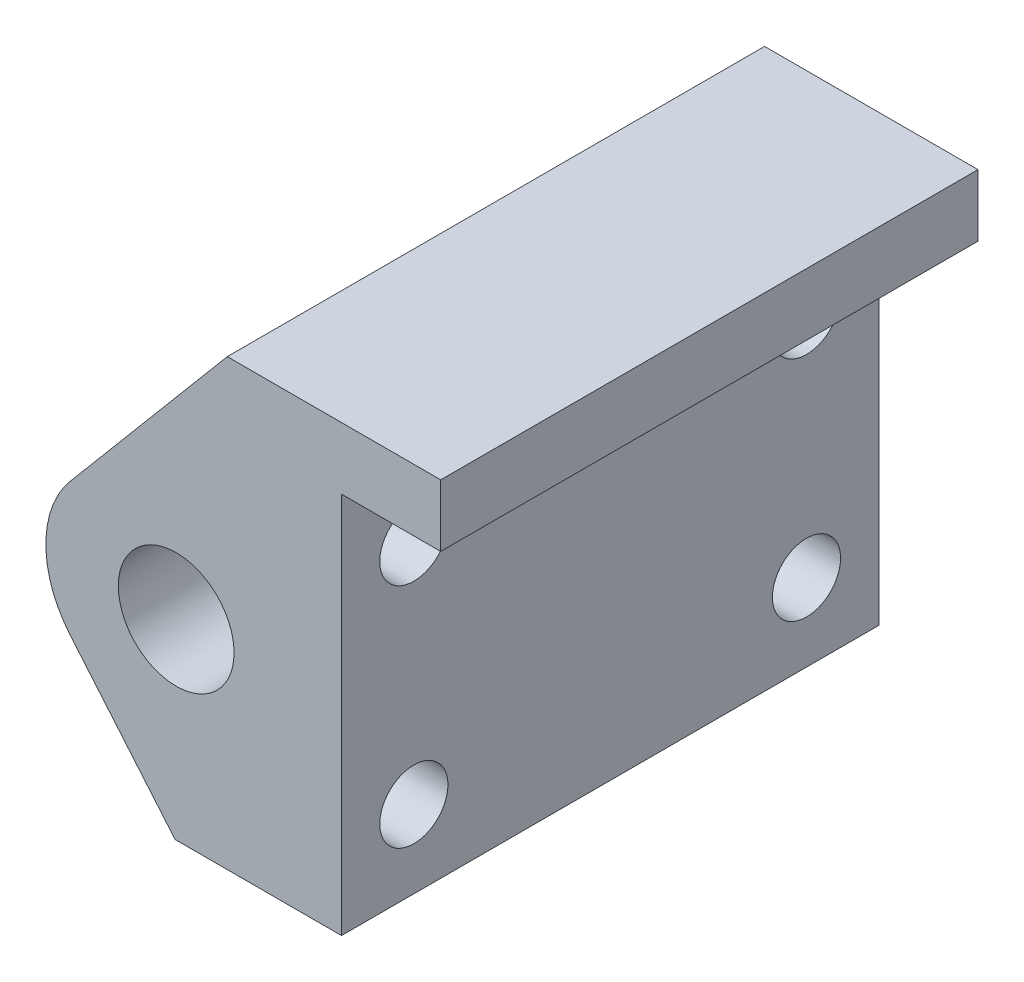
ISO-10303-21;
HEADER;
FILE_DESCRIPTION(('STEP AP214'),'2;1');
FILE_NAME('part.step','',(''),(''),'','','');
FILE_SCHEMA(('AUTOMOTIVE_DESIGN { 1 0 10303 214 1 1 1 1 }'));
ENDSEC;
DATA;
#1=APPLICATION_CONTEXT('core data for automotive mechanical design processes');
#2=APPLICATION_PROTOCOL_DEFINITION('international standard','automotive_design',2000,#1);
#3=PRODUCT_CONTEXT('',#1,'mechanical');
#4=PRODUCT('Part','Part','',(#3));
#5=PRODUCT_RELATED_PRODUCT_CATEGORY('part','',(#4));
#6=PRODUCT_DEFINITION_FORMATION('','',#4);
#7=PRODUCT_DEFINITION_CONTEXT('part definition',#1,'design');
#8=PRODUCT_DEFINITION('design','',#6,#7);
#9=PRODUCT_DEFINITION_SHAPE('','',#8);
#10=(LENGTH_UNIT() NAMED_UNIT(*) SI_UNIT(.MILLI.,.METRE.));
#11=(NAMED_UNIT(*) PLANE_ANGLE_UNIT() SI_UNIT($,.RADIAN.));
#12=(NAMED_UNIT(*) SI_UNIT($,.STERADIAN.) SOLID_ANGLE_UNIT());
#13=UNCERTAINTY_MEASURE_WITH_UNIT(LENGTH_MEASURE(1.E-05),#10,'distance_accuracy_value','');
#14=(GEOMETRIC_REPRESENTATION_CONTEXT(3) GLOBAL_UNCERTAINTY_ASSIGNED_CONTEXT((#13)) GLOBAL_UNIT_ASSIGNED_CONTEXT((#10,
#11,#12)) REPRESENTATION_CONTEXT('',''));
#15=CARTESIAN_POINT('',(0.,0.,0.));
#16=DIRECTION('',(0.,0.,1.));
#17=DIRECTION('',(1.,0.,0.));
#18=AXIS2_PLACEMENT_3D('',#15,#16,#17);
#19=CARTESIAN_POINT('',(-15.0280704909388,12.6577813905121,26.));
#20=DIRECTION('',(0.764846895843587,-0.644212096997898,0.));
#21=DIRECTION('',(0.644212096997898,0.764846895843587,0.));
#22=AXIS2_PLACEMENT_3D('',#19,#20,#21);
#23=PLANE('',#22);
#24=DIRECTION('',(-0.644212096997898,-0.764846895843587,0.));
#25=VECTOR('',#24,1.);
#26=CARTESIAN_POINT('',(-15.0280704909388,12.6577813905121,26.));
#27=LINE('',#26,#25);
#28=CARTESIAN_POINT('',(-2.52682765857616,27.5,26.));
#29=VERTEX_POINT('',#28);
#30=CARTESIAN_POINT('',(-10.1316856899561,18.4710604849895,26.));
#31=VERTEX_POINT('',#30);
#32=EDGE_CURVE('E128',#29,#31,#27,.T.);
#33=ORIENTED_EDGE('',*,*,#32,.F.);
#34=DIRECTION('',(0.,0.,1.));
#35=VECTOR('',#34,1.);
#36=CARTESIAN_POINT('',(-2.52682765857616,27.5,26.));
#37=LINE('',#36,#35);
#38=CARTESIAN_POINT('',(-2.52682765857616,27.5,0.));
#39=VERTEX_POINT('',#38);
#40=EDGE_CURVE('E175',#39,#29,#37,.T.);
#41=ORIENTED_EDGE('',*,*,#40,.F.);
#42=DIRECTION('',(-0.644212096997898,-0.764846895843587,0.));
#43=VECTOR('',#42,1.);
#44=CARTESIAN_POINT('',(-15.0280704909388,12.6577813905121,0.));
#45=LINE('',#44,#43);
#46=CARTESIAN_POINT('',(-10.1316856899561,18.4710604849895,0.));
#47=VERTEX_POINT('',#46);
#48=EDGE_CURVE('E140',#39,#47,#45,.T.);
#49=ORIENTED_EDGE('',*,*,#48,.T.);
#50=DIRECTION('',(0.,0.,-1.));
#51=VECTOR('',#50,1.);
#52=CARTESIAN_POINT('',(-10.1316856899561,18.4710604849895,26.));
#53=LINE('',#52,#51);
#54=EDGE_CURVE('E11',#31,#47,#53,.T.);
#55=ORIENTED_EDGE('',*,*,#54,.F.);
#56=EDGE_LOOP('',(#33,#41,#49,#55));
#57=FACE_BOUND('',#56,.T.);
#58=CARTESIAN_POINT('',(-8.21218989037251,20.75,3.5));
#59=DIRECTION('',(0.764846895843587,-0.644212096997898,0.));
#60=DIRECTION('',(0.644212096997898,0.764846895843587,0.));
#61=AXIS2_PLACEMENT_3D('',#58,#59,#60);
#62=ELLIPSE('',#61,2.15729449771791,1.65);
#63=CARTESIAN_POINT('',(-6.82243467815562,22.4,3.5));
#64=VERTEX_POINT('',#63);
#65=EDGE_CURVE('E190',#64,#64,#62,.F.);
#66=ORIENTED_EDGE('',*,*,#65,.F.);
#67=EDGE_LOOP('',(#66));
#68=FACE_BOUND('',#67,.T.);
#69=CARTESIAN_POINT('',(-8.21218989037251,20.75,22.5));
#70=DIRECTION('',(0.764846895843587,-0.644212096997898,0.));
#71=DIRECTION('',(0.644212096997898,0.764846895843587,0.));
#72=AXIS2_PLACEMENT_3D('',#69,#70,#71);
#73=ELLIPSE('',#72,2.15729449771792,1.65);
#74=CARTESIAN_POINT('',(-6.82243467815562,22.4,22.5));
#75=VERTEX_POINT('',#74);
#76=EDGE_CURVE('E196',#75,#75,#73,.T.);
#77=ORIENTED_EDGE('',*,*,#76,.T.);
#78=EDGE_LOOP('',(#77));
#79=FACE_BOUND('',#78,.T.);
#80=ADVANCED_FACE('F38',(#57,#68,#79),#23,.F.);
#81=CARTESIAN_POINT('',(0.,0.,26.));
#82=DIRECTION('',(0.764846895843587,0.644212096997898,0.));
#83=DIRECTION('',(-0.644212096997898,0.764846895843587,0.));
#84=AXIS2_PLACEMENT_3D('',#81,#82,#83);
#85=PLANE('',#84);
#86=DIRECTION('',(0.644212096997898,-0.764846895843587,0.));
#87=VECTOR('',#86,1.);
#88=CARTESIAN_POINT('',(0.,0.,0.));
#89=LINE('',#88,#87);
#90=CARTESIAN_POINT('',(-10.1316856899561,12.0289395150105,0.));
#91=VERTEX_POINT('',#90);
#92=CARTESIAN_POINT('',(-5.05365531715231,5.99999999999999,0.));
#93=VERTEX_POINT('',#92);
#94=EDGE_CURVE('E117',#91,#93,#89,.T.);
#95=ORIENTED_EDGE('',*,*,#94,.T.);
#96=DIRECTION('',(0.,0.,-1.));
#97=VECTOR('',#96,1.);
#98=CARTESIAN_POINT('',(-5.05365531715231,5.99999999999999,26.));
#99=LINE('',#98,#97);
#100=CARTESIAN_POINT('',(-5.05365531715231,5.99999999999999,26.));
#101=VERTEX_POINT('',#100);
#102=EDGE_CURVE('E52',#101,#93,#99,.T.);
#103=ORIENTED_EDGE('',*,*,#102,.F.);
#104=DIRECTION('',(0.644212096997898,-0.764846895843587,0.));
#105=VECTOR('',#104,1.);
#106=CARTESIAN_POINT('',(0.,0.,26.));
#107=LINE('',#106,#105);
#108=CARTESIAN_POINT('',(-10.1316856899561,12.0289395150105,26.));
#109=VERTEX_POINT('',#108);
#110=EDGE_CURVE('E115',#109,#101,#107,.T.);
#111=ORIENTED_EDGE('',*,*,#110,.F.);
#112=DIRECTION('',(0.,0.,-1.));
#113=VECTOR('',#112,1.);
#114=CARTESIAN_POINT('',(-10.1316856899561,12.0289395150105,26.));
#115=LINE('',#114,#113);
#116=EDGE_CURVE('E45',#109,#91,#115,.T.);
#117=ORIENTED_EDGE('',*,*,#116,.T.);
#118=EDGE_LOOP('',(#95,#103,#111,#117));
#119=FACE_BOUND('',#118,.T.);
#120=CARTESIAN_POINT('',(-8.21218989037251,9.75,22.5));
#121=DIRECTION('',(0.764846895843587,0.644212096997898,0.));
#122=DIRECTION('',(0.644212096997898,-0.764846895843587,0.));
#123=AXIS2_PLACEMENT_3D('',#120,#121,#122);
#124=ELLIPSE('',#123,2.15729449771792,1.65);
#125=CARTESIAN_POINT('',(-6.82243467815562,8.1,22.5));
#126=VERTEX_POINT('',#125);
#127=EDGE_CURVE('E193',#126,#126,#124,.F.);
#128=ORIENTED_EDGE('',*,*,#127,.F.);
#129=EDGE_LOOP('',(#128));
#130=FACE_BOUND('',#129,.T.);
#131=CARTESIAN_POINT('',(-8.21218989037251,9.75,3.5));
#132=DIRECTION('',(0.764846895843587,0.644212096997898,0.));
#133=DIRECTION('',(0.644212096997898,-0.764846895843587,0.));
#134=AXIS2_PLACEMENT_3D('',#131,#132,#133);
#135=ELLIPSE('',#134,2.15729449771792,1.65);
#136=CARTESIAN_POINT('',(-6.82243467815562,8.1,3.5));
#137=VERTEX_POINT('',#136);
#138=EDGE_CURVE('E143',#137,#137,#135,.T.);
#139=ORIENTED_EDGE('',*,*,#138,.T.);
#140=EDGE_LOOP('',(#139));
#141=FACE_BOUND('',#140,.T.);
#142=ADVANCED_FACE('F112',(#119,#130,#141),#85,.F.);
#143=CARTESIAN_POINT('',(3.,0.,26.));
#144=DIRECTION('',(-1.,0.,0.));
#145=DIRECTION('',(0.,-1.,0.));
#146=AXIS2_PLACEMENT_3D('',#143,#144,#145);
#147=PLANE('',#146);
#148=CARTESIAN_POINT('',(3.,20.75,22.5));
#149=DIRECTION('',(1.,0.,0.));
#150=DIRECTION('',(0.,0.,-1.));
#151=AXIS2_PLACEMENT_3D('',#148,#149,#150);
#152=CIRCLE('',#151,1.65);
#153=CARTESIAN_POINT('',(3.,20.75,20.85));
#154=VERTEX_POINT('',#153);
#155=EDGE_CURVE('E183',#154,#154,#152,.T.);
#156=ORIENTED_EDGE('',*,*,#155,.F.);
#157=EDGE_LOOP('',(#156));
#158=FACE_BOUND('',#157,.T.);
#159=CARTESIAN_POINT('',(3.,9.75,22.5));
#160=DIRECTION('',(1.,0.,0.));
#161=DIRECTION('',(0.,0.,-1.));
#162=AXIS2_PLACEMENT_3D('',#159,#160,#161);
#163=CIRCLE('',#162,1.65);
#164=CARTESIAN_POINT('',(3.,9.75,20.85));
#165=VERTEX_POINT('',#164);
#166=EDGE_CURVE('E179',#165,#165,#163,.F.);
#167=ORIENTED_EDGE('',*,*,#166,.T.);
#168=EDGE_LOOP('',(#167));
#169=FACE_BOUND('',#168,.T.);
#170=CARTESIAN_POINT('',(3.,20.75,3.5));
#171=DIRECTION('',(1.,0.,0.));
#172=DIRECTION('',(0.,0.,-1.));
#173=AXIS2_PLACEMENT_3D('',#170,#171,#172);
#174=CIRCLE('',#173,1.65);
#175=CARTESIAN_POINT('',(3.,20.75,1.85));
#176=VERTEX_POINT('',#175);
#177=EDGE_CURVE('E182',#176,#176,#174,.F.);
#178=ORIENTED_EDGE('',*,*,#177,.T.);
#179=EDGE_LOOP('',(#178));
#180=FACE_BOUND('',#179,.T.);
#181=DIRECTION('',(0.,1.,0.));
#182=VECTOR('',#181,1.);
#183=CARTESIAN_POINT('',(3.,0.,0.));
#184=LINE('',#183,#182);
#185=CARTESIAN_POINT('',(3.,5.99999999999999,0.));
#186=VERTEX_POINT('',#185);
#187=CARTESIAN_POINT('',(3.,24.5,0.));
#188=VERTEX_POINT('',#187);
#189=EDGE_CURVE('E146',#186,#188,#184,.T.);
#190=ORIENTED_EDGE('',*,*,#189,.T.);
#191=DIRECTION('',(0.,0.,-1.));
#192=VECTOR('',#191,1.);
#193=CARTESIAN_POINT('',(3.,24.5,26.));
#194=LINE('',#193,#192);
#195=CARTESIAN_POINT('',(3.,24.5,26.));
#196=VERTEX_POINT('',#195);
#197=EDGE_CURVE('E158',#196,#188,#194,.T.);
#198=ORIENTED_EDGE('',*,*,#197,.F.);
#199=DIRECTION('',(0.,1.,0.));
#200=VECTOR('',#199,1.);
#201=CARTESIAN_POINT('',(3.,0.,26.));
#202=LINE('',#201,#200);
#203=CARTESIAN_POINT('',(3.,5.99999999999999,26.));
#204=VERTEX_POINT('',#203);
#205=EDGE_CURVE('E124',#204,#196,#202,.T.);
#206=ORIENTED_EDGE('',*,*,#205,.F.);
#207=DIRECTION('',(0.,0.,-1.));
#208=VECTOR('',#207,1.);
#209=CARTESIAN_POINT('',(3.,6.,26.));
#210=LINE('',#209,#208);
#211=EDGE_CURVE('E103',#204,#186,#210,.T.);
#212=ORIENTED_EDGE('',*,*,#211,.T.);
#213=EDGE_LOOP('',(#190,#198,#206,#212));
#214=FACE_BOUND('',#213,.T.);
#215=CARTESIAN_POINT('',(3.,9.75,3.5));
#216=DIRECTION('',(1.,0.,0.));
#217=DIRECTION('',(0.,0.,-1.));
#218=AXIS2_PLACEMENT_3D('',#215,#216,#217);
#219=CIRCLE('',#218,1.65);
#220=CARTESIAN_POINT('',(3.,9.75,1.85));
#221=VERTEX_POINT('',#220);
#222=EDGE_CURVE('E178',#221,#221,#219,.T.);
#223=ORIENTED_EDGE('',*,*,#222,.F.);
#224=EDGE_LOOP('',(#223));
#225=FACE_BOUND('',#224,.T.);
#226=ADVANCED_FACE('F210',(#158,#169,#180,#214,#225),#147,.F.);
#227=CARTESIAN_POINT('',(-6.30745121073813,15.25,26.));
#228=DIRECTION('',(0.,0.,-1.));
#229=DIRECTION('',(-1.,0.,0.));
#230=AXIS2_PLACEMENT_3D('',#227,#228,#229);
#231=CYLINDRICAL_SURFACE('',#230,5.);
#232=CARTESIAN_POINT('',(-6.30745121073813,15.25,0.));
#233=DIRECTION('',(0.,0.,1.));
#234=DIRECTION('',(1.,0.,0.));
#235=AXIS2_PLACEMENT_3D('',#232,#233,#234);
#236=CIRCLE('',#235,5.);
#237=EDGE_CURVE('E142',#47,#91,#236,.T.);
#238=ORIENTED_EDGE('',*,*,#237,.T.);
#239=ORIENTED_EDGE('',*,*,#116,.F.);
#240=CARTESIAN_POINT('',(-6.30745121073813,15.25,26.));
#241=DIRECTION('',(0.,0.,1.));
#242=DIRECTION('',(1.,0.,0.));
#243=AXIS2_PLACEMENT_3D('',#240,#241,#242);
#244=CIRCLE('',#243,5.);
#245=EDGE_CURVE('E122',#31,#109,#244,.T.);
#246=ORIENTED_EDGE('',*,*,#245,.F.);
#247=ORIENTED_EDGE('',*,*,#54,.T.);
#248=EDGE_LOOP('',(#238,#239,#246,#247));
#249=FACE_BOUND('',#248,.T.);
#250=ADVANCED_FACE('F207',(#249),#231,.T.);
#251=CARTESIAN_POINT('',(0.,24.5,26.));
#252=DIRECTION('',(0.,1.,0.));
#253=DIRECTION('',(0.,0.,1.));
#254=AXIS2_PLACEMENT_3D('',#251,#252,#253);
#255=PLANE('',#254);
#256=DIRECTION('',(1.,0.,0.));
#257=VECTOR('',#256,1.);
#258=CARTESIAN_POINT('',(0.,24.5,0.));
#259=LINE('',#258,#257);
#260=CARTESIAN_POINT('',(7.8,24.5,0.));
#261=VERTEX_POINT('',#260);
#262=EDGE_CURVE('E148',#188,#261,#259,.T.);
#263=ORIENTED_EDGE('',*,*,#262,.T.);
#264=DIRECTION('',(0.,0.,-1.));
#265=VECTOR('',#264,1.);
#266=CARTESIAN_POINT('',(7.8,24.5,26.));
#267=LINE('',#266,#265);
#268=CARTESIAN_POINT('',(7.8,24.5,26.));
#269=VERTEX_POINT('',#268);
#270=EDGE_CURVE('E139',#269,#261,#267,.T.);
#271=ORIENTED_EDGE('',*,*,#270,.F.);
#272=DIRECTION('',(1.,0.,0.));
#273=VECTOR('',#272,1.);
#274=CARTESIAN_POINT('',(0.,24.5,26.));
#275=LINE('',#274,#273);
#276=EDGE_CURVE('E126',#196,#269,#275,.T.);
#277=ORIENTED_EDGE('',*,*,#276,.F.);
#278=ORIENTED_EDGE('',*,*,#197,.T.);
#279=EDGE_LOOP('',(#263,#271,#277,#278));
#280=FACE_BOUND('',#279,.T.);
#281=ADVANCED_FACE('F209',(#280),#255,.F.);
#282=CARTESIAN_POINT('',(7.8,0.,26.));
#283=DIRECTION('',(1.,0.,0.));
#284=DIRECTION('',(0.,0.,-1.));
#285=AXIS2_PLACEMENT_3D('',#282,#283,#284);
#286=PLANE('',#285);
#287=DIRECTION('',(0.,0.,-1.));
#288=VECTOR('',#287,1.);
#289=CARTESIAN_POINT('',(7.8,27.5,26.));
#290=LINE('',#289,#288);
#291=CARTESIAN_POINT('',(7.8,27.5,26.));
#292=VERTEX_POINT('',#291);
#293=CARTESIAN_POINT('',(7.8,27.5,0.));
#294=VERTEX_POINT('',#293);
#295=EDGE_CURVE('E60',#292,#294,#290,.T.);
#296=ORIENTED_EDGE('',*,*,#295,.F.);
#297=DIRECTION('',(0.,-1.,0.));
#298=VECTOR('',#297,1.);
#299=CARTESIAN_POINT('',(7.8,0.,26.));
#300=LINE('',#299,#298);
#301=EDGE_CURVE('E134',#292,#269,#300,.T.);
#302=ORIENTED_EDGE('',*,*,#301,.T.);
#303=ORIENTED_EDGE('',*,*,#270,.T.);
#304=DIRECTION('',(0.,-1.,0.));
#305=VECTOR('',#304,1.);
#306=CARTESIAN_POINT('',(7.8,0.,0.));
#307=LINE('',#306,#305);
#308=EDGE_CURVE('E151',#294,#261,#307,.T.);
#309=ORIENTED_EDGE('',*,*,#308,.F.);
#310=EDGE_LOOP('',(#296,#302,#303,#309));
#311=FACE_BOUND('',#310,.T.);
#312=ADVANCED_FACE('F215',(#311),#286,.T.);
#313=CARTESIAN_POINT('',(-5.,15.25,26.));
#314=DIRECTION('',(0.,0.,-1.));
#315=DIRECTION('',(-1.,0.,0.));
#316=AXIS2_PLACEMENT_3D('',#313,#314,#315);
#317=CYLINDRICAL_SURFACE('',#316,2.8);
#318=CARTESIAN_POINT('',(-5.,15.25,26.));
#319=DIRECTION('',(0.,0.,1.));
#320=DIRECTION('',(1.,0.,0.));
#321=AXIS2_PLACEMENT_3D('',#318,#319,#320);
#322=CIRCLE('',#321,2.8);
#323=CARTESIAN_POINT('',(-7.8,15.25,26.));
#324=VERTEX_POINT('',#323);
#325=EDGE_CURVE('E136',#324,#324,#322,.T.);
#326=CARTESIAN_POINT('',(-5.,15.25,0.));
#327=DIRECTION('',(0.,0.,1.));
#328=DIRECTION('',(1.,0.,0.));
#329=AXIS2_PLACEMENT_3D('',#326,#327,#328);
#330=CIRCLE('',#329,2.8);
#331=CARTESIAN_POINT('',(-7.8,15.25,0.));
#332=VERTEX_POINT('',#331);
#333=EDGE_CURVE('E153',#332,#332,#330,.T.);
#334=CARTESIAN_POINT('',(-7.8,15.25,26.));
#335=CARTESIAN_POINT('',(-7.8,15.25,25.7291666666667));
#336=CARTESIAN_POINT('',(-7.8,15.25,25.4583333333333));
#337=CARTESIAN_POINT('',(-7.8,15.25,24.9166666666667));
#338=CARTESIAN_POINT('',(-7.8,15.25,24.6458333333333));
#339=CARTESIAN_POINT('',(-7.8,15.25,24.1041666666667));
#340=CARTESIAN_POINT('',(-7.8,15.25,23.8333333333333));
#341=CARTESIAN_POINT('',(-7.8,15.25,23.2916666666667));
#342=CARTESIAN_POINT('',(-7.8,15.25,23.0208333333333));
#343=CARTESIAN_POINT('',(-7.8,15.25,22.4791666666667));
#344=CARTESIAN_POINT('',(-7.8,15.25,22.2083333333333));
#345=CARTESIAN_POINT('',(-7.8,15.25,21.6666666666667));
#346=CARTESIAN_POINT('',(-7.8,15.25,21.3958333333333));
#347=CARTESIAN_POINT('',(-7.8,15.25,20.8541666666667));
#348=CARTESIAN_POINT('',(-7.8,15.25,20.5833333333333));
#349=CARTESIAN_POINT('',(-7.8,15.25,20.0416666666667));
#350=CARTESIAN_POINT('',(-7.8,15.25,19.7708333333333));
#351=CARTESIAN_POINT('',(-7.8,15.25,19.2291666666667));
#352=CARTESIAN_POINT('',(-7.8,15.25,18.9583333333333));
#353=CARTESIAN_POINT('',(-7.8,15.25,18.4166666666667));
#354=CARTESIAN_POINT('',(-7.8,15.25,18.1458333333333));
#355=CARTESIAN_POINT('',(-7.8,15.25,17.6041666666667));
#356=CARTESIAN_POINT('',(-7.8,15.25,17.3333333333333));
#357=CARTESIAN_POINT('',(-7.8,15.25,16.7916666666667));
#358=CARTESIAN_POINT('',(-7.8,15.25,16.5208333333333));
#359=CARTESIAN_POINT('',(-7.8,15.25,15.9791666666667));
#360=CARTESIAN_POINT('',(-7.8,15.25,15.7083333333333));
#361=CARTESIAN_POINT('',(-7.8,15.25,15.1666666666667));
#362=CARTESIAN_POINT('',(-7.8,15.25,14.8958333333333));
#363=CARTESIAN_POINT('',(-7.8,15.25,14.3541666666667));
#364=CARTESIAN_POINT('',(-7.8,15.25,14.0833333333333));
#365=CARTESIAN_POINT('',(-7.8,15.25,13.5416666666667));
#366=CARTESIAN_POINT('',(-7.8,15.25,13.2708333333333));
#367=CARTESIAN_POINT('',(-7.8,15.25,12.7291666666667));
#368=CARTESIAN_POINT('',(-7.8,15.25,12.4583333333333));
#369=CARTESIAN_POINT('',(-7.8,15.25,11.9166666666667));
#370=CARTESIAN_POINT('',(-7.8,15.25,11.6458333333333));
#371=CARTESIAN_POINT('',(-7.8,15.25,11.1041666666667));
#372=CARTESIAN_POINT('',(-7.8,15.25,10.8333333333333));
#373=CARTESIAN_POINT('',(-7.8,15.25,10.2916666666667));
#374=CARTESIAN_POINT('',(-7.8,15.25,10.0208333333333));
#375=CARTESIAN_POINT('',(-7.8,15.25,9.47916666666667));
#376=CARTESIAN_POINT('',(-7.8,15.25,9.20833333333333));
#377=CARTESIAN_POINT('',(-7.8,15.25,8.66666666666667));
#378=CARTESIAN_POINT('',(-7.8,15.25,8.39583333333333));
#379=CARTESIAN_POINT('',(-7.8,15.25,7.85416666666667));
#380=CARTESIAN_POINT('',(-7.8,15.25,7.58333333333333));
#381=CARTESIAN_POINT('',(-7.8,15.25,7.04166666666667));
#382=CARTESIAN_POINT('',(-7.8,15.25,6.77083333333333));
#383=CARTESIAN_POINT('',(-7.8,15.25,6.22916666666667));
#384=CARTESIAN_POINT('',(-7.8,15.25,5.95833333333333));
#385=CARTESIAN_POINT('',(-7.8,15.25,5.41666666666667));
#386=CARTESIAN_POINT('',(-7.8,15.25,5.14583333333333));
#387=CARTESIAN_POINT('',(-7.8,15.25,4.60416666666667));
#388=CARTESIAN_POINT('',(-7.8,15.25,4.33333333333333));
#389=CARTESIAN_POINT('',(-7.8,15.25,3.79166666666667));
#390=CARTESIAN_POINT('',(-7.8,15.25,3.52083333333333));
#391=CARTESIAN_POINT('',(-7.8,15.25,2.97916666666667));
#392=CARTESIAN_POINT('',(-7.8,15.25,2.70833333333333));
#393=CARTESIAN_POINT('',(-7.8,15.25,2.16666666666667));
#394=CARTESIAN_POINT('',(-7.8,15.25,1.89583333333333));
#395=CARTESIAN_POINT('',(-7.8,15.25,1.35416666666667));
#396=CARTESIAN_POINT('',(-7.8,15.25,1.08333333333333));
#397=CARTESIAN_POINT('',(-7.8,15.25,0.541666666666667));
#398=CARTESIAN_POINT('',(-7.8,15.25,0.270833333333334));
#399=CARTESIAN_POINT('',(-7.8,15.25,0.));
#400=B_SPLINE_CURVE_WITH_KNOTS('',3,(#334,#335,#336,#337,#338,#339,#340,#341,#342,#343,#344,
#345,#346,#347,#348,#349,#350,#351,#352,#353,#354,#355,#356,#357,#358,#359,#360,#361,#362,#363,
#364,#365,#366,#367,#368,#369,#370,#371,#372,#373,#374,#375,#376,#377,#378,#379,#380,#381,#382,
#383,#384,#385,#386,#387,#388,#389,#390,#391,#392,#393,#394,#395,#396,#397,#398,#399),
.UNSPECIFIED.,.F.,.F.,(4,2,2,2,2,2,2,2,2,2,2,2,2,2,2,2,2,2,2,2,2,2,2,2,2,2,2,2,2,2,2,2,4),(0.,
0.812499999999997,1.625,2.4375,3.25,4.0625,4.875,5.6875,6.5,7.3125,8.125,8.93749999999999,
9.74999999999999,10.5625,11.375,12.1875,13.,13.8125,14.625,15.4375,16.25,17.0625,17.875,18.6875,
19.5,20.3125,21.125,21.9375,22.75,23.5625,24.375,25.1875,26.),.UNSPECIFIED.);
#401=EDGE_CURVE('BSEAM230',#324,#332,#400,.T.);
#402=ORIENTED_EDGE('',*,*,#325,.T.);
#403=ORIENTED_EDGE('',*,*,#333,.F.);
#404=ORIENTED_EDGE('',*,*,#401,.T.);
#405=ORIENTED_EDGE('',*,*,#401,.F.);
#406=EDGE_LOOP('',(#402,#404,#403,#405));
#407=FACE_BOUND('',#406,.T.);
#408=ADVANCED_FACE('F230',(#407),#317,.F.);
#409=CARTESIAN_POINT('',(0.,0.,26.));
#410=DIRECTION('',(0.,0.,1.));
#411=DIRECTION('',(1.,0.,0.));
#412=AXIS2_PLACEMENT_3D('',#409,#410,#411);
#413=PLANE('',#412);
#414=DIRECTION('',(1.,0.,0.));
#415=VECTOR('',#414,1.);
#416=CARTESIAN_POINT('',(-11.3084512107381,5.99999999999999,26.));
#417=LINE('',#416,#415);
#418=EDGE_CURVE('E100',#101,#204,#417,.T.);
#419=ORIENTED_EDGE('',*,*,#418,.T.);
#420=ORIENTED_EDGE('',*,*,#205,.T.);
#421=ORIENTED_EDGE('',*,*,#276,.T.);
#422=ORIENTED_EDGE('',*,*,#301,.F.);
#423=DIRECTION('',(1.,0.,0.));
#424=VECTOR('',#423,1.);
#425=CARTESIAN_POINT('',(-11.3084512107381,27.5,26.));
#426=LINE('',#425,#424);
#427=EDGE_CURVE('E172',#29,#292,#426,.T.);
#428=ORIENTED_EDGE('',*,*,#427,.F.);
#429=ORIENTED_EDGE('',*,*,#32,.T.);
#430=ORIENTED_EDGE('',*,*,#245,.T.);
#431=ORIENTED_EDGE('',*,*,#110,.T.);
#432=EDGE_LOOP('',(#419,#420,#421,#422,#428,#429,#430,#431));
#433=FACE_BOUND('',#432,.T.);
#434=ORIENTED_EDGE('',*,*,#325,.F.);
#435=EDGE_LOOP('',(#434));
#436=FACE_BOUND('',#435,.T.);
#437=ADVANCED_FACE('F119',(#433,#436),#413,.T.);
#438=CARTESIAN_POINT('',(0.,0.,0.));
#439=DIRECTION('',(0.,0.,1.));
#440=DIRECTION('',(1.,0.,0.));
#441=AXIS2_PLACEMENT_3D('',#438,#439,#440);
#442=PLANE('',#441);
#443=ORIENTED_EDGE('',*,*,#189,.F.);
#444=DIRECTION('',(1.,0.,0.));
#445=VECTOR('',#444,1.);
#446=CARTESIAN_POINT('',(-11.3084512107381,5.99999999999999,0.));
#447=LINE('',#446,#445);
#448=EDGE_CURVE('E107',#93,#186,#447,.T.);
#449=ORIENTED_EDGE('',*,*,#448,.F.);
#450=ORIENTED_EDGE('',*,*,#94,.F.);
#451=ORIENTED_EDGE('',*,*,#237,.F.);
#452=ORIENTED_EDGE('',*,*,#48,.F.);
#453=DIRECTION('',(1.,0.,0.));
#454=VECTOR('',#453,1.);
#455=CARTESIAN_POINT('',(-11.3084512107381,27.5,0.));
#456=LINE('',#455,#454);
#457=EDGE_CURVE('E173',#39,#294,#456,.T.);
#458=ORIENTED_EDGE('',*,*,#457,.T.);
#459=ORIENTED_EDGE('',*,*,#308,.T.);
#460=ORIENTED_EDGE('',*,*,#262,.F.);
#461=EDGE_LOOP('',(#443,#449,#450,#451,#452,#458,#459,#460));
#462=FACE_BOUND('',#461,.T.);
#463=ORIENTED_EDGE('',*,*,#333,.T.);
#464=EDGE_LOOP('',(#463));
#465=FACE_BOUND('',#464,.T.);
#466=ADVANCED_FACE('F165',(#462,#465),#442,.F.);
#467=CARTESIAN_POINT('',(-11.3074512107381,20.75,3.5));
#468=DIRECTION('',(1.,0.,0.));
#469=DIRECTION('',(0.,0.,-1.));
#470=AXIS2_PLACEMENT_3D('',#467,#468,#469);
#471=CYLINDRICAL_SURFACE('',#470,1.65);
#472=ORIENTED_EDGE('',*,*,#177,.F.);
#473=EDGE_LOOP('',(#472));
#474=FACE_BOUND('',#473,.T.);
#475=ORIENTED_EDGE('',*,*,#65,.T.);
#476=EDGE_LOOP('',(#475));
#477=FACE_BOUND('',#476,.T.);
#478=ADVANCED_FACE('F237',(#474,#477),#471,.F.);
#479=CARTESIAN_POINT('',(-11.3074512107381,9.75,22.5));
#480=DIRECTION('',(1.,0.,0.));
#481=DIRECTION('',(0.,0.,-1.));
#482=AXIS2_PLACEMENT_3D('',#479,#480,#481);
#483=CYLINDRICAL_SURFACE('',#482,1.65);
#484=ORIENTED_EDGE('',*,*,#166,.F.);
#485=EDGE_LOOP('',(#484));
#486=FACE_BOUND('',#485,.T.);
#487=ORIENTED_EDGE('',*,*,#127,.T.);
#488=EDGE_LOOP('',(#487));
#489=FACE_BOUND('',#488,.T.);
#490=ADVANCED_FACE('F242',(#486,#489),#483,.F.);
#491=CARTESIAN_POINT('',(-11.3074512107381,20.75,22.5));
#492=DIRECTION('',(1.,0.,0.));
#493=DIRECTION('',(0.,0.,-1.));
#494=AXIS2_PLACEMENT_3D('',#491,#492,#493);
#495=CYLINDRICAL_SURFACE('',#494,1.65);
#496=ORIENTED_EDGE('',*,*,#155,.T.);
#497=EDGE_LOOP('',(#496));
#498=FACE_BOUND('',#497,.T.);
#499=ORIENTED_EDGE('',*,*,#76,.F.);
#500=EDGE_LOOP('',(#499));
#501=FACE_BOUND('',#500,.T.);
#502=ADVANCED_FACE('F248',(#498,#501),#495,.F.);
#503=CARTESIAN_POINT('',(-11.3074512107381,9.75,3.5));
#504=DIRECTION('',(1.,0.,0.));
#505=DIRECTION('',(0.,0.,-1.));
#506=AXIS2_PLACEMENT_3D('',#503,#504,#505);
#507=CYLINDRICAL_SURFACE('',#506,1.65);
#508=ORIENTED_EDGE('',*,*,#222,.T.);
#509=EDGE_LOOP('',(#508));
#510=FACE_BOUND('',#509,.T.);
#511=ORIENTED_EDGE('',*,*,#138,.F.);
#512=EDGE_LOOP('',(#511));
#513=FACE_BOUND('',#512,.T.);
#514=ADVANCED_FACE('F244',(#510,#513),#507,.F.);
#515=CARTESIAN_POINT('',(-11.3084512107381,27.5,26.));
#516=DIRECTION('',(0.,-1.,0.));
#517=DIRECTION('',(0.,0.,-1.));
#518=AXIS2_PLACEMENT_3D('',#515,#516,#517);
#519=PLANE('',#518);
#520=ORIENTED_EDGE('',*,*,#40,.T.);
#521=ORIENTED_EDGE('',*,*,#427,.T.);
#522=ORIENTED_EDGE('',*,*,#295,.T.);
#523=ORIENTED_EDGE('',*,*,#457,.F.);
#524=EDGE_LOOP('',(#520,#521,#522,#523));
#525=FACE_BOUND('',#524,.T.);
#526=ADVANCED_FACE('F247',(#525),#519,.F.);
#527=CARTESIAN_POINT('',(-11.3084512107381,5.99999999999999,26.));
#528=DIRECTION('',(0.,1.,0.));
#529=DIRECTION('',(0.,0.,1.));
#530=AXIS2_PLACEMENT_3D('',#527,#528,#529);
#531=PLANE('',#530);
#532=ORIENTED_EDGE('',*,*,#418,.F.);
#533=ORIENTED_EDGE('',*,*,#102,.T.);
#534=ORIENTED_EDGE('',*,*,#448,.T.);
#535=ORIENTED_EDGE('',*,*,#211,.F.);
#536=EDGE_LOOP('',(#532,#533,#534,#535));
#537=FACE_BOUND('',#536,.T.);
#538=ADVANCED_FACE('F101',(#537),#531,.F.);
#539=CLOSED_SHELL('',(#80,#142,#226,#250,#281,#312,#408,#437,#466,#478,#490,#502,#514,#526,#538));
#540=MANIFOLD_SOLID_BREP('B2',#539);
#541=ADVANCED_BREP_SHAPE_REPRESENTATION('',(#18,#540),#14);
#542=SHAPE_DEFINITION_REPRESENTATION(#9,#541);
ENDSEC;
END-ISO-10303-21;
